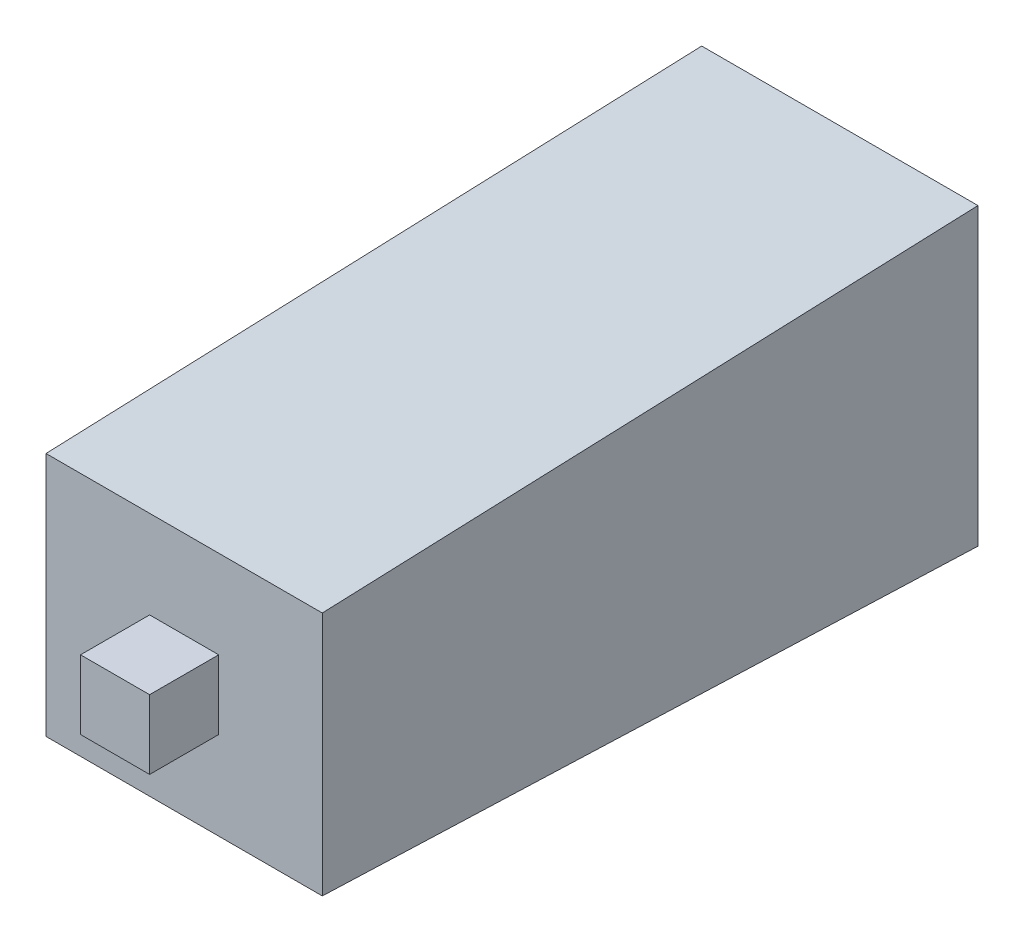
ISO-10303-21;
HEADER;
FILE_DESCRIPTION(('STEP AP214'),'2;1');
FILE_NAME('part.step','',(''),(''),'','','');
FILE_SCHEMA(('AUTOMOTIVE_DESIGN { 1 0 10303 214 1 1 1 1 }'));
ENDSEC;
DATA;
#1=APPLICATION_CONTEXT('core data for automotive mechanical design processes');
#2=APPLICATION_PROTOCOL_DEFINITION('international standard','automotive_design',2000,#1);
#3=PRODUCT_CONTEXT('',#1,'mechanical');
#4=PRODUCT('Part','Part','',(#3));
#5=PRODUCT_RELATED_PRODUCT_CATEGORY('part','',(#4));
#6=PRODUCT_DEFINITION_FORMATION('','',#4);
#7=PRODUCT_DEFINITION_CONTEXT('part definition',#1,'design');
#8=PRODUCT_DEFINITION('design','',#6,#7);
#9=PRODUCT_DEFINITION_SHAPE('','',#8);
#10=(LENGTH_UNIT() NAMED_UNIT(*) SI_UNIT(.MILLI.,.METRE.));
#11=(NAMED_UNIT(*) PLANE_ANGLE_UNIT() SI_UNIT($,.RADIAN.));
#12=(NAMED_UNIT(*) SI_UNIT($,.STERADIAN.) SOLID_ANGLE_UNIT());
#13=UNCERTAINTY_MEASURE_WITH_UNIT(LENGTH_MEASURE(1.E-05),#10,'distance_accuracy_value','');
#14=(GEOMETRIC_REPRESENTATION_CONTEXT(3) GLOBAL_UNCERTAINTY_ASSIGNED_CONTEXT((#13)) GLOBAL_UNIT_ASSIGNED_CONTEXT((#10,
#11,#12)) REPRESENTATION_CONTEXT('',''));
#15=CARTESIAN_POINT('',(0.,0.,0.));
#16=DIRECTION('',(0.,0.,1.));
#17=DIRECTION('',(1.,0.,0.));
#18=AXIS2_PLACEMENT_3D('',#15,#16,#17);
#19=CARTESIAN_POINT('',(0.,-0.0212504665995525,239.859592583932));
#20=DIRECTION('',(0.,8.85954415549065E-05,-0.999999996075424));
#21=DIRECTION('',(0.,0.999999996075424,8.85954415549065E-05));
#22=AXIS2_PLACEMENT_3D('',#19,#20,#21);
#23=PLANE('',#22);
#24=DIRECTION('',(0.,-0.999999996075424,-8.85954415537977E-05));
#25=VECTOR('',#24,1.);
#26=CARTESIAN_POINT('',(15.7387702745491,-8.25715385723615,239.858862920432));
#27=LINE('',#26,#25);
#28=CARTESIAN_POINT('',(15.7387702745491,-8.25715385723615,239.858862920432));
#29=VERTEX_POINT('',#28);
#30=CARTESIAN_POINT('',(15.7387702745491,-28.3571537783522,239.857082152056));
#31=VERTEX_POINT('',#30);
#32=EDGE_CURVE('E58',#29,#31,#27,.T.);
#33=ORIENTED_EDGE('',*,*,#32,.F.);
#34=DIRECTION('',(1.,0.,0.));
#35=VECTOR('',#34,1.);
#36=CARTESIAN_POINT('',(15.7387702745491,-8.25715385723615,239.858862920432));
#37=LINE('',#36,#35);
#38=CARTESIAN_POINT('',(-4.36122972545085,-8.25715385723615,239.858862920432));
#39=VERTEX_POINT('',#38);
#40=EDGE_CURVE('E154',#39,#29,#37,.T.);
#41=ORIENTED_EDGE('',*,*,#40,.F.);
#42=DIRECTION('',(0.,0.999999996075424,8.85954415537978E-05));
#43=VECTOR('',#42,1.);
#44=CARTESIAN_POINT('',(-4.36122972545085,-8.25715385723615,239.858862920432));
#45=LINE('',#44,#43);
#46=CARTESIAN_POINT('',(-4.36122972545085,-28.3571537783522,239.857082152056));
#47=VERTEX_POINT('',#46);
#48=EDGE_CURVE('E158',#47,#39,#45,.T.);
#49=ORIENTED_EDGE('',*,*,#48,.F.);
#50=DIRECTION('',(-1.,0.,0.));
#51=VECTOR('',#50,1.);
#52=CARTESIAN_POINT('',(15.7387702745491,-28.3571537783522,239.857082152056));
#53=LINE('',#52,#51);
#54=EDGE_CURVE('E167',#31,#47,#53,.T.);
#55=ORIENTED_EDGE('',*,*,#54,.F.);
#56=EDGE_LOOP('',(#33,#41,#49,#55));
#57=FACE_BOUND('',#56,.T.);
#58=DIRECTION('',(0.,0.999999996075424,8.85954415549065E-05));
#59=VECTOR('',#58,1.);
#60=CARTESIAN_POINT('',(-34.3112297254508,-68.3123188312692,239.853542306552));
#61=LINE('',#60,#59);
#62=CARTESIAN_POINT('',(-34.3112297254508,-61.0287528464613,239.854187597299));
#63=VERTEX_POINT('',#62);
#64=CARTESIAN_POINT('',(-34.3112297254508,24.3958526160456,239.861755827969));
#65=VERTEX_POINT('',#64);
#66=EDGE_CURVE('E238',#63,#65,#61,.T.);
#67=ORIENTED_EDGE('',*,*,#66,.T.);
#68=DIRECTION('',(1.,0.,0.));
#69=VECTOR('',#68,1.);
#70=CARTESIAN_POINT('',(-74.3112297254508,24.3958526160456,239.861755827969));
#71=LINE('',#70,#69);
#72=CARTESIAN_POINT('',(45.6887702745492,24.3958526160456,239.861755827969));
#73=VERTEX_POINT('',#72);
#74=EDGE_CURVE('E44',#65,#73,#71,.T.);
#75=ORIENTED_EDGE('',*,*,#74,.T.);
#76=DIRECTION('',(0.,-0.999999996075424,-8.85954415549065E-05));
#77=VECTOR('',#76,1.);
#78=CARTESIAN_POINT('',(45.6887702745492,31.6876803838156,239.862401850673));
#79=LINE('',#78,#77);
#80=CARTESIAN_POINT('',(45.6887702745492,-61.0287528464613,239.854187597299));
#81=VERTEX_POINT('',#80);
#82=EDGE_CURVE('E253',#73,#81,#79,.T.);
#83=ORIENTED_EDGE('',*,*,#82,.T.);
#84=DIRECTION('',(1.,0.,0.));
#85=VECTOR('',#84,1.);
#86=CARTESIAN_POINT('',(-74.3112297254508,-61.0287528464613,239.854187597299));
#87=LINE('',#86,#85);
#88=EDGE_CURVE('E224',#63,#81,#87,.T.);
#89=ORIENTED_EDGE('',*,*,#88,.F.);
#90=EDGE_LOOP('',(#67,#75,#83,#89));
#91=FACE_BOUND('',#90,.T.);
#92=ADVANCED_FACE('F40',(#57,#91),#23,.T.);
#93=CARTESIAN_POINT('',(2.98182289682424E-13,-0.0380714095059369,429.721988940198));
#94=DIRECTION('',(0.,8.8595441556101E-05,-0.999999996075424));
#95=DIRECTION('',(0.,0.999999996075424,8.8595441556101E-05));
#96=AXIS2_PLACEMENT_3D('',#93,#94,#95);
#97=PLANE('',#96);
#98=DIRECTION('',(0.,0.999999996075424,8.8595441556101E-05));
#99=VECTOR('',#98,1.);
#100=CARTESIAN_POINT('',(-34.3112297254508,-68.3291397741746,429.715938662818));
#101=LINE('',#100,#99);
#102=CARTESIAN_POINT('',(-34.3112297254508,-53.8157140484837,429.717224486183));
#103=VERTEX_POINT('',#102);
#104=CARTESIAN_POINT('',(-34.3112297254508,17.1492207142147,429.723511655938));
#105=VERTEX_POINT('',#104);
#106=EDGE_CURVE('E234',#103,#105,#101,.T.);
#107=ORIENTED_EDGE('',*,*,#106,.F.);
#108=DIRECTION('',(1.,0.,0.));
#109=VECTOR('',#108,1.);
#110=CARTESIAN_POINT('',(-74.3112297254505,-53.8157140484837,429.717224486184));
#111=LINE('',#110,#109);
#112=CARTESIAN_POINT('',(45.6887702745492,-53.8157140484837,429.717224486184));
#113=VERTEX_POINT('',#112);
#114=EDGE_CURVE('E223',#103,#113,#111,.T.);
#115=ORIENTED_EDGE('',*,*,#114,.T.);
#116=DIRECTION('',(0.,-0.999999996075424,-8.8595441556101E-05));
#117=VECTOR('',#116,1.);
#118=CARTESIAN_POINT('',(45.6887702745492,31.6708594409101,429.724798206938));
#119=LINE('',#118,#117);
#120=CARTESIAN_POINT('',(45.6887702745492,17.1492207142147,429.723511655938));
#121=VERTEX_POINT('',#120);
#122=EDGE_CURVE('E231',#121,#113,#119,.T.);
#123=ORIENTED_EDGE('',*,*,#122,.F.);
#124=DIRECTION('',(1.,0.,0.));
#125=VECTOR('',#124,1.);
#126=CARTESIAN_POINT('',(-74.3112297254505,17.1492207142147,429.723511655938));
#127=LINE('',#126,#125);
#128=EDGE_CURVE('E228',#105,#121,#127,.T.);
#129=ORIENTED_EDGE('',*,*,#128,.F.);
#130=EDGE_LOOP('',(#107,#115,#123,#129));
#131=FACE_BOUND('',#130,.T.);
#132=DIRECTION('',(0.,-0.999999996075424,-8.85954415580369E-05));
#133=VECTOR('',#132,1.);
#134=CARTESIAN_POINT('',(-4.31122972545079,-8.33324670638027,429.721254025477));
#135=LINE('',#134,#133);
#136=CARTESIAN_POINT('',(-4.31122972545079,-8.33324670638027,429.721254025477));
#137=VERTEX_POINT('',#136);
#138=CARTESIAN_POINT('',(-4.31122972545079,-28.3332466278888,429.719482116646));
#139=VERTEX_POINT('',#138);
#140=EDGE_CURVE('E66',#137,#139,#135,.T.);
#141=ORIENTED_EDGE('',*,*,#140,.F.);
#142=DIRECTION('',(-1.,0.,0.));
#143=VECTOR('',#142,1.);
#144=CARTESIAN_POINT('',(-4.31122972545079,-8.33324670638027,429.721254025477));
#145=LINE('',#144,#143);
#146=CARTESIAN_POINT('',(15.6887702745492,-8.33324670638027,429.721254025477));
#147=VERTEX_POINT('',#146);
#148=EDGE_CURVE('E186',#147,#137,#145,.T.);
#149=ORIENTED_EDGE('',*,*,#148,.F.);
#150=DIRECTION('',(0.,0.999999996075424,8.85954415552614E-05));
#151=VECTOR('',#150,1.);
#152=CARTESIAN_POINT('',(15.6887702745492,-8.33324670638027,429.721254025477));
#153=LINE('',#152,#151);
#154=CARTESIAN_POINT('',(15.6887702745492,-28.3332466278888,429.719482116646));
#155=VERTEX_POINT('',#154);
#156=EDGE_CURVE('E202',#155,#147,#153,.T.);
#157=ORIENTED_EDGE('',*,*,#156,.F.);
#158=DIRECTION('',(1.,0.,0.));
#159=VECTOR('',#158,1.);
#160=CARTESIAN_POINT('',(-4.31122972545079,-28.3332466278888,429.719482116646));
#161=LINE('',#160,#159);
#162=EDGE_CURVE('E198',#139,#155,#161,.T.);
#163=ORIENTED_EDGE('',*,*,#162,.F.);
#164=EDGE_LOOP('',(#141,#149,#157,#163));
#165=FACE_BOUND('',#164,.T.);
#166=ADVANCED_FACE('F276',(#131,#165),#97,.F.);
#167=CARTESIAN_POINT('',(45.6887702745492,31.6424845178765,750.));
#168=DIRECTION('',(-1.,0.,0.));
#169=DIRECTION('',(0.,0.,1.));
#170=AXIS2_PLACEMENT_3D('',#167,#168,#169);
#171=PLANE('',#170);
#172=ORIENTED_EDGE('',*,*,#82,.F.);
#173=DIRECTION('',(0.,0.0381401679043731,-0.999272399094574));
#174=VECTOR('',#173,1.);
#175=CARTESIAN_POINT('',(45.6887702745492,33.5020759229185,1.27870518789766));
#176=LINE('',#175,#174);
#177=EDGE_CURVE('E11',#121,#73,#176,.T.);
#178=ORIENTED_EDGE('',*,*,#177,.F.);
#179=ORIENTED_EDGE('',*,*,#122,.T.);
#180=DIRECTION('',(0.,-0.0379633617237289,-0.999279131757805));
#181=VECTOR('',#180,1.);
#182=CARTESIAN_POINT('',(45.6887702745492,-70.039904475994,2.66086836421801));
#183=LINE('',#182,#181);
#184=EDGE_CURVE('E50',#113,#81,#183,.T.);
#185=ORIENTED_EDGE('',*,*,#184,.T.);
#186=EDGE_LOOP('',(#172,#178,#179,#185));
#187=FACE_BOUND('',#186,.T.);
#188=ADVANCED_FACE('F267',(#187),#171,.F.);
#189=CARTESIAN_POINT('',(-34.3112297254508,-68.3575154821235,750.));
#190=DIRECTION('',(1.,0.,0.));
#191=DIRECTION('',(0.,1.,0.));
#192=AXIS2_PLACEMENT_3D('',#189,#190,#191);
#193=PLANE('',#192);
#194=ORIENTED_EDGE('',*,*,#66,.F.);
#195=DIRECTION('',(0.,-0.0379633617237289,-0.999279131757805));
#196=VECTOR('',#195,1.);
#197=CARTESIAN_POINT('',(-34.3112297254508,-41.6864261215724,748.986745363951));
#198=LINE('',#197,#196);
#199=EDGE_CURVE('E245',#103,#63,#198,.T.);
#200=ORIENTED_EDGE('',*,*,#199,.F.);
#201=ORIENTED_EDGE('',*,*,#106,.T.);
#202=DIRECTION('',(0.,0.0381401679043731,-0.999272399094574));
#203=VECTOR('',#202,1.);
#204=CARTESIAN_POINT('',(-34.3112297254508,4.81832531852815,752.792971022926));
#205=LINE('',#204,#203);
#206=EDGE_CURVE('E227',#105,#65,#205,.T.);
#207=ORIENTED_EDGE('',*,*,#206,.T.);
#208=EDGE_LOOP('',(#194,#200,#201,#207));
#209=FACE_BOUND('',#208,.T.);
#210=ADVANCED_FACE('F274',(#209),#193,.F.);
#211=CARTESIAN_POINT('',(-74.3112297254508,-70.039904475994,2.66086836421801));
#212=DIRECTION('',(0.,-0.999279131757805,0.0379633617237289));
#213=DIRECTION('',(0.,-0.0379633617237289,-0.999279131757805));
#214=AXIS2_PLACEMENT_3D('',#211,#212,#213);
#215=PLANE('',#214);
#216=ORIENTED_EDGE('',*,*,#199,.T.);
#217=ORIENTED_EDGE('',*,*,#88,.T.);
#218=ORIENTED_EDGE('',*,*,#184,.F.);
#219=ORIENTED_EDGE('',*,*,#114,.F.);
#220=EDGE_LOOP('',(#216,#217,#218,#219));
#221=FACE_BOUND('',#220,.T.);
#222=ADVANCED_FACE('F270',(#221),#215,.T.);
#223=CARTESIAN_POINT('',(-74.3112297254508,33.5020759229185,1.27870518789766));
#224=DIRECTION('',(0.,-0.999272399094574,-0.0381401679043731));
#225=DIRECTION('',(0.,0.0381401679043731,-0.999272399094574));
#226=AXIS2_PLACEMENT_3D('',#223,#224,#225);
#227=PLANE('',#226);
#228=ORIENTED_EDGE('',*,*,#74,.F.);
#229=ORIENTED_EDGE('',*,*,#206,.F.);
#230=ORIENTED_EDGE('',*,*,#128,.T.);
#231=ORIENTED_EDGE('',*,*,#177,.T.);
#232=EDGE_LOOP('',(#228,#229,#230,#231));
#233=FACE_BOUND('',#232,.T.);
#234=ADVANCED_FACE('F42',(#233),#227,.F.);
#235=CARTESIAN_POINT('',(-4.31122972545078,-8.33501861521139,449.721253946985));
#236=DIRECTION('',(1.,0.,0.));
#237=DIRECTION('',(0.,0.,-1.));
#238=AXIS2_PLACEMENT_3D('',#235,#236,#237);
#239=PLANE('',#238);
#240=ORIENTED_EDGE('',*,*,#140,.T.);
#241=DIRECTION('',(0.,8.8595441556101E-05,-0.999999996075424));
#242=VECTOR('',#241,1.);
#243=CARTESIAN_POINT('',(-4.31122972545078,-28.3350185367199,449.719482038154));
#244=LINE('',#243,#242);
#245=CARTESIAN_POINT('',(-4.31122972545078,-28.3350185367199,449.719482038154));
#246=VERTEX_POINT('',#245);
#247=EDGE_CURVE('E219',#246,#139,#244,.T.);
#248=ORIENTED_EDGE('',*,*,#247,.F.);
#249=DIRECTION('',(0.,-0.999999996075424,-8.85954415580369E-05));
#250=VECTOR('',#249,1.);
#251=CARTESIAN_POINT('',(-4.31122972545078,-8.33501861521139,449.721253946985));
#252=LINE('',#251,#250);
#253=CARTESIAN_POINT('',(-4.31122972545078,-8.33501861521139,449.721253946985));
#254=VERTEX_POINT('',#253);
#255=EDGE_CURVE('E181',#254,#246,#252,.T.);
#256=ORIENTED_EDGE('',*,*,#255,.F.);
#257=DIRECTION('',(0.,8.8595441556101E-05,-0.999999996075424));
#258=VECTOR('',#257,1.);
#259=CARTESIAN_POINT('',(-4.31122972545078,-8.33501861521139,449.721253946985));
#260=LINE('',#259,#258);
#261=EDGE_CURVE('E195',#254,#137,#260,.T.);
#262=ORIENTED_EDGE('',*,*,#261,.T.);
#263=EDGE_LOOP('',(#240,#248,#256,#262));
#264=FACE_BOUND('',#263,.T.);
#265=ADVANCED_FACE('F285',(#264),#239,.F.);
#266=CARTESIAN_POINT('',(-4.31122972545078,-28.3350185367199,449.719482038154));
#267=DIRECTION('',(0.,0.999999996075424,8.8595441556101E-05));
#268=DIRECTION('',(0.,-8.8595441556101E-05,0.999999996075424));
#269=AXIS2_PLACEMENT_3D('',#266,#267,#268);
#270=PLANE('',#269);
#271=ORIENTED_EDGE('',*,*,#162,.T.);
#272=DIRECTION('',(0.,8.8595441556101E-05,-0.999999996075424));
#273=VECTOR('',#272,1.);
#274=CARTESIAN_POINT('',(15.6887702745492,-28.3350185367199,449.719482038154));
#275=LINE('',#274,#273);
#276=CARTESIAN_POINT('',(15.6887702745492,-28.3350185367199,449.719482038154));
#277=VERTEX_POINT('',#276);
#278=EDGE_CURVE('E215',#277,#155,#275,.T.);
#279=ORIENTED_EDGE('',*,*,#278,.F.);
#280=DIRECTION('',(1.,0.,0.));
#281=VECTOR('',#280,1.);
#282=CARTESIAN_POINT('',(-4.31122972545078,-28.3350185367199,449.719482038154));
#283=LINE('',#282,#281);
#284=EDGE_CURVE('E185',#246,#277,#283,.T.);
#285=ORIENTED_EDGE('',*,*,#284,.F.);
#286=ORIENTED_EDGE('',*,*,#247,.T.);
#287=EDGE_LOOP('',(#271,#279,#285,#286));
#288=FACE_BOUND('',#287,.T.);
#289=ADVANCED_FACE('F294',(#288),#270,.F.);
#290=CARTESIAN_POINT('',(15.6887702745492,-8.33501861521139,449.721253946985));
#291=DIRECTION('',(-1.,0.,0.));
#292=DIRECTION('',(0.,0.,1.));
#293=AXIS2_PLACEMENT_3D('',#290,#291,#292);
#294=PLANE('',#293);
#295=ORIENTED_EDGE('',*,*,#156,.T.);
#296=DIRECTION('',(0.,8.8595441556101E-05,-0.999999996075424));
#297=VECTOR('',#296,1.);
#298=CARTESIAN_POINT('',(15.6887702745492,-8.33501861521139,449.721253946985));
#299=LINE('',#298,#297);
#300=CARTESIAN_POINT('',(15.6887702745492,-8.33501861521139,449.721253946985));
#301=VERTEX_POINT('',#300);
#302=EDGE_CURVE('E211',#301,#147,#299,.T.);
#303=ORIENTED_EDGE('',*,*,#302,.F.);
#304=DIRECTION('',(0.,0.999999996075424,8.85954415552614E-05));
#305=VECTOR('',#304,1.);
#306=CARTESIAN_POINT('',(15.6887702745492,-8.33501861521139,449.721253946985));
#307=LINE('',#306,#305);
#308=EDGE_CURVE('E189',#277,#301,#307,.T.);
#309=ORIENTED_EDGE('',*,*,#308,.F.);
#310=ORIENTED_EDGE('',*,*,#278,.T.);
#311=EDGE_LOOP('',(#295,#303,#309,#310));
#312=FACE_BOUND('',#311,.T.);
#313=ADVANCED_FACE('F351',(#312),#294,.F.);
#314=CARTESIAN_POINT('',(-4.31122972545078,-8.33501861521139,449.721253946985));
#315=DIRECTION('',(0.,-0.999999996075424,-8.8595441556101E-05));
#316=DIRECTION('',(0.,8.8595441556101E-05,-0.999999996075424));
#317=AXIS2_PLACEMENT_3D('',#314,#315,#316);
#318=PLANE('',#317);
#319=ORIENTED_EDGE('',*,*,#148,.T.);
#320=ORIENTED_EDGE('',*,*,#261,.F.);
#321=DIRECTION('',(-1.,0.,0.));
#322=VECTOR('',#321,1.);
#323=CARTESIAN_POINT('',(-4.31122972545078,-8.33501861521139,449.721253946985));
#324=LINE('',#323,#322);
#325=EDGE_CURVE('E192',#301,#254,#324,.T.);
#326=ORIENTED_EDGE('',*,*,#325,.F.);
#327=ORIENTED_EDGE('',*,*,#302,.T.);
#328=EDGE_LOOP('',(#319,#320,#326,#327));
#329=FACE_BOUND('',#328,.T.);
#330=ADVANCED_FACE('F359',(#329),#318,.F.);
#331=CARTESIAN_POINT('',(0.,-0.0398433183378909,449.721988861706));
#332=DIRECTION('',(0.,-8.85954415580369E-05,0.999999996075424));
#333=DIRECTION('',(0.,-0.999999996075424,-8.85954415580369E-05));
#334=AXIS2_PLACEMENT_3D('',#331,#332,#333);
#335=PLANE('',#334);
#336=ORIENTED_EDGE('',*,*,#255,.T.);
#337=ORIENTED_EDGE('',*,*,#284,.T.);
#338=ORIENTED_EDGE('',*,*,#308,.T.);
#339=ORIENTED_EDGE('',*,*,#325,.T.);
#340=EDGE_LOOP('',(#336,#337,#338,#339));
#341=FACE_BOUND('',#340,.T.);
#342=ADVANCED_FACE('F367',(#341),#335,.T.);
#343=CARTESIAN_POINT('',(15.7387702745491,-8.25892576606725,259.85886284194));
#344=DIRECTION('',(1.,0.,0.));
#345=DIRECTION('',(0.,1.,0.));
#346=AXIS2_PLACEMENT_3D('',#343,#344,#345);
#347=PLANE('',#346);
#348=ORIENTED_EDGE('',*,*,#32,.T.);
#349=DIRECTION('',(0.,8.85954415549065E-05,-0.999999996075424));
#350=VECTOR('',#349,1.);
#351=CARTESIAN_POINT('',(15.7387702745491,-28.3589256871833,259.857082073565));
#352=LINE('',#351,#350);
#353=CARTESIAN_POINT('',(15.7387702745491,-28.3589256871833,259.857082073565));
#354=VERTEX_POINT('',#353);
#355=EDGE_CURVE('E129',#354,#31,#352,.T.);
#356=ORIENTED_EDGE('',*,*,#355,.F.);
#357=DIRECTION('',(0.,-0.999999996075424,-8.85954415537977E-05));
#358=VECTOR('',#357,1.);
#359=CARTESIAN_POINT('',(15.7387702745491,-8.25892576606725,259.85886284194));
#360=LINE('',#359,#358);
#361=CARTESIAN_POINT('',(15.7387702745491,-8.25892576606725,259.85886284194));
#362=VERTEX_POINT('',#361);
#363=EDGE_CURVE('E133',#362,#354,#360,.T.);
#364=ORIENTED_EDGE('',*,*,#363,.F.);
#365=DIRECTION('',(0.,8.85954415549065E-05,-0.999999996075424));
#366=VECTOR('',#365,1.);
#367=CARTESIAN_POINT('',(15.7387702745491,-8.25892576606725,259.85886284194));
#368=LINE('',#367,#366);
#369=EDGE_CURVE('E173',#362,#29,#368,.T.);
#370=ORIENTED_EDGE('',*,*,#369,.T.);
#371=EDGE_LOOP('',(#348,#356,#364,#370));
#372=FACE_BOUND('',#371,.T.);
#373=ADVANCED_FACE('F131',(#372),#347,.F.);
#374=CARTESIAN_POINT('',(15.7387702745491,-8.25892576606725,259.85886284194));
#375=DIRECTION('',(0.,0.999999996075424,8.85954415549065E-05));
#376=DIRECTION('',(0.,-8.85954415549065E-05,0.999999996075424));
#377=AXIS2_PLACEMENT_3D('',#374,#375,#376);
#378=PLANE('',#377);
#379=ORIENTED_EDGE('',*,*,#40,.T.);
#380=ORIENTED_EDGE('',*,*,#369,.F.);
#381=DIRECTION('',(1.,0.,0.));
#382=VECTOR('',#381,1.);
#383=CARTESIAN_POINT('',(15.7387702745491,-8.25892576606725,259.85886284194));
#384=LINE('',#383,#382);
#385=CARTESIAN_POINT('',(-4.36122972545085,-8.25892576606725,259.85886284194));
#386=VERTEX_POINT('',#385);
#387=EDGE_CURVE('E140',#386,#362,#384,.T.);
#388=ORIENTED_EDGE('',*,*,#387,.F.);
#389=DIRECTION('',(0.,8.85954415549065E-05,-0.999999996075424));
#390=VECTOR('',#389,1.);
#391=CARTESIAN_POINT('',(-4.36122972545085,-8.25892576606725,259.85886284194));
#392=LINE('',#391,#390);
#393=EDGE_CURVE('E176',#386,#39,#392,.T.);
#394=ORIENTED_EDGE('',*,*,#393,.T.);
#395=EDGE_LOOP('',(#379,#380,#388,#394));
#396=FACE_BOUND('',#395,.T.);
#397=ADVANCED_FACE('F381',(#396),#378,.F.);
#398=CARTESIAN_POINT('',(-4.36122972545085,-8.25892576606725,259.85886284194));
#399=DIRECTION('',(-1.,0.,0.));
#400=DIRECTION('',(0.,-1.,0.));
#401=AXIS2_PLACEMENT_3D('',#398,#399,#400);
#402=PLANE('',#401);
#403=ORIENTED_EDGE('',*,*,#48,.T.);
#404=ORIENTED_EDGE('',*,*,#393,.F.);
#405=DIRECTION('',(0.,0.999999996075424,8.85954415537978E-05));
#406=VECTOR('',#405,1.);
#407=CARTESIAN_POINT('',(-4.36122972545085,-8.25892576606725,259.85886284194));
#408=LINE('',#407,#406);
#409=CARTESIAN_POINT('',(-4.36122972545085,-28.3589256871833,259.857082073565));
#410=VERTEX_POINT('',#409);
#411=EDGE_CURVE('E149',#410,#386,#408,.T.);
#412=ORIENTED_EDGE('',*,*,#411,.F.);
#413=DIRECTION('',(0.,8.85954415549065E-05,-0.999999996075424));
#414=VECTOR('',#413,1.);
#415=CARTESIAN_POINT('',(-4.36122972545085,-28.3589256871833,259.857082073565));
#416=LINE('',#415,#414);
#417=EDGE_CURVE('E139',#410,#47,#416,.T.);
#418=ORIENTED_EDGE('',*,*,#417,.T.);
#419=EDGE_LOOP('',(#403,#404,#412,#418));
#420=FACE_BOUND('',#419,.T.);
#421=ADVANCED_FACE('F388',(#420),#402,.F.);
#422=CARTESIAN_POINT('',(15.7387702745491,-28.3589256871833,259.857082073565));
#423=DIRECTION('',(0.,-0.999999996075424,-8.85954415549065E-05));
#424=DIRECTION('',(0.,8.85954415549065E-05,-0.999999996075424));
#425=AXIS2_PLACEMENT_3D('',#422,#423,#424);
#426=PLANE('',#425);
#427=ORIENTED_EDGE('',*,*,#54,.T.);
#428=ORIENTED_EDGE('',*,*,#417,.F.);
#429=DIRECTION('',(-1.,0.,0.));
#430=VECTOR('',#429,1.);
#431=CARTESIAN_POINT('',(15.7387702745491,-28.3589256871833,259.857082073565));
#432=LINE('',#431,#430);
#433=EDGE_CURVE('E143',#354,#410,#432,.T.);
#434=ORIENTED_EDGE('',*,*,#433,.F.);
#435=ORIENTED_EDGE('',*,*,#355,.T.);
#436=EDGE_LOOP('',(#427,#428,#434,#435));
#437=FACE_BOUND('',#436,.T.);
#438=ADVANCED_FACE('F144',(#437),#426,.F.);
#439=CARTESIAN_POINT('',(0.,-0.0230223754306655,259.85959250544));
#440=DIRECTION('',(0.,8.85954415549685E-05,-0.999999996075424));
#441=DIRECTION('',(0.,0.999999996075424,8.85954415549685E-05));
#442=AXIS2_PLACEMENT_3D('',#439,#440,#441);
#443=PLANE('',#442);
#444=ORIENTED_EDGE('',*,*,#363,.T.);
#445=ORIENTED_EDGE('',*,*,#433,.T.);
#446=ORIENTED_EDGE('',*,*,#411,.T.);
#447=ORIENTED_EDGE('',*,*,#387,.T.);
#448=EDGE_LOOP('',(#444,#445,#446,#447));
#449=FACE_BOUND('',#448,.T.);
#450=ADVANCED_FACE('F151',(#449),#443,.T.);
#451=CLOSED_SHELL('',(#92,#166,#188,#210,#222,#234,#265,#289,#313,#330,#342,#373,#397,#421,#438,#450));
#452=MANIFOLD_SOLID_BREP('B2',#451);
#453=ADVANCED_BREP_SHAPE_REPRESENTATION('',(#18,#452),#14);
#454=SHAPE_DEFINITION_REPRESENTATION(#9,#453);
ENDSEC;
END-ISO-10303-21;
